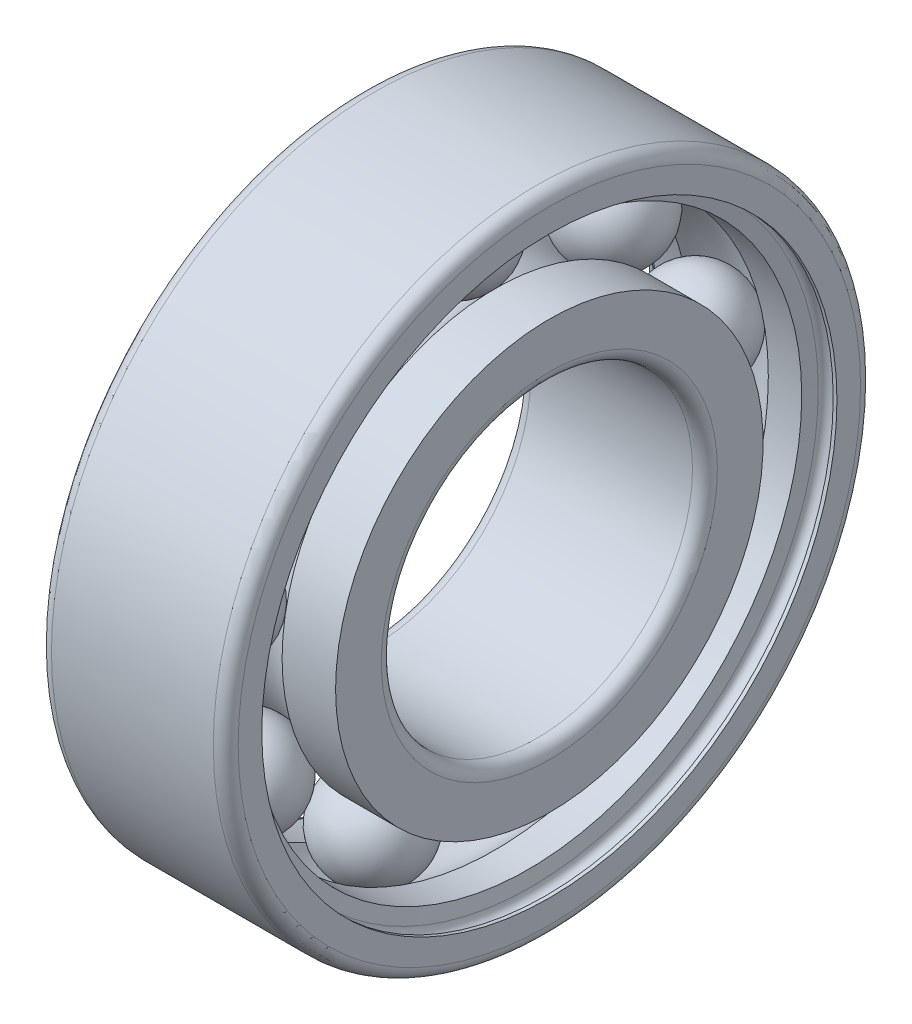
ISO-10303-21;
HEADER;
FILE_DESCRIPTION(('STEP AP214'),'2;1');
FILE_NAME('part.step','',(''),(''),'','','');
FILE_SCHEMA(('AUTOMOTIVE_DESIGN { 1 0 10303 214 1 1 1 1 }'));
ENDSEC;
DATA;
#1=APPLICATION_CONTEXT('core data for automotive mechanical design processes');
#2=APPLICATION_PROTOCOL_DEFINITION('international standard','automotive_design',2000,#1);
#3=PRODUCT_CONTEXT('',#1,'mechanical');
#4=PRODUCT('Part','Part','',(#3));
#5=PRODUCT_RELATED_PRODUCT_CATEGORY('part','',(#4));
#6=PRODUCT_DEFINITION_FORMATION('','',#4);
#7=PRODUCT_DEFINITION_CONTEXT('part definition',#1,'design');
#8=PRODUCT_DEFINITION('design','',#6,#7);
#9=PRODUCT_DEFINITION_SHAPE('','',#8);
#10=(LENGTH_UNIT() NAMED_UNIT(*) SI_UNIT(.MILLI.,.METRE.));
#11=(NAMED_UNIT(*) PLANE_ANGLE_UNIT() SI_UNIT($,.RADIAN.));
#12=(NAMED_UNIT(*) SI_UNIT($,.STERADIAN.) SOLID_ANGLE_UNIT());
#13=UNCERTAINTY_MEASURE_WITH_UNIT(LENGTH_MEASURE(1.E-05),#10,'distance_accuracy_value','');
#14=(GEOMETRIC_REPRESENTATION_CONTEXT(3) GLOBAL_UNCERTAINTY_ASSIGNED_CONTEXT((#13)) GLOBAL_UNIT_ASSIGNED_CONTEXT((#10,
#11,#12)) REPRESENTATION_CONTEXT('',''));
#15=CARTESIAN_POINT('',(0.,0.,0.));
#16=DIRECTION('',(0.,0.,1.));
#17=DIRECTION('',(1.,0.,0.));
#18=AXIS2_PLACEMENT_3D('',#15,#16,#17);
#19=CARTESIAN_POINT('',(7.5,-18.3427999577409,6.67623319771706));
#20=DIRECTION('',(0.594835222019223,0.114027365122037,0.795719057613092));
#21=DIRECTION('',(0.389955010349224,-0.906543165461709,-0.161600058967199));
#22=AXIS2_PLACEMENT_3D('',#19,#20,#21);
#23=SPHERICAL_SURFACE('',#22,3.969);
#24=CARTESIAN_POINT('',(5.13909900380571,-18.7953745699103,3.51802425805069));
#25=VERTEX_POINT('',#24);
#26=VERTEX_LOOP('',#25);
#27=FACE_BOUND('',#26,.T.);
#28=CARTESIAN_POINT('',(9.8609009961943,-17.8902253455716,9.83444213738342));
#29=VERTEX_POINT('',#28);
#30=VERTEX_LOOP('',#29);
#31=FACE_BOUND('',#30,.T.);
#32=ADVANCED_FACE('P0_F16',(#27,#31),#23,.T.);
#33=CLOSED_SHELL('',(#32));
#34=MANIFOLD_SOLID_BREP('P0_B1',#33);
#35=CARTESIAN_POINT('',(7.5,14.9531875296825,-12.5472141410813));
#36=DIRECTION('',(0.685398310930959,0.0351972029685046,0.727317201966365));
#37=DIRECTION('',(0.179287355466741,-0.976238967489698,-0.121710815149643));
#38=AXIS2_PLACEMENT_3D('',#35,#36,#37);
#39=SPHERICAL_SURFACE('',#38,3.969);
#40=CARTESIAN_POINT('',(10.220345896085,15.0928852282645,-9.66049216647675));
#41=VERTEX_POINT('',#40);
#42=VERTEX_LOOP('',#41);
#43=FACE_BOUND('',#42,.T.);
#44=CARTESIAN_POINT('',(4.77965410391502,14.8134898311005,-15.4339361156858));
#45=VERTEX_POINT('',#44);
#46=VERTEX_LOOP('',#45);
#47=FACE_BOUND('',#46,.T.);
#48=ADVANCED_FACE('P1_F16',(#43,#47),#39,.T.);
#49=CLOSED_SHELL('',(#48));
#50=MANIFOLD_SOLID_BREP('P1_B1',#49);
#51=CARTESIAN_POINT('',(7.5,-18.3427999577409,-6.67623319771706));
#52=DIRECTION('',(0.563600590312569,0.63589128279516,0.527253877239845));
#53=DIRECTION('',(-0.499752807633324,-0.245740386476579,0.830577385748584));
#54=AXIS2_PLACEMENT_3D('',#51,#52,#53);
#55=SPHERICAL_SURFACE('',#54,3.969);
#56=CARTESIAN_POINT('',(9.73693074295059,-15.818947456327,-4.58356255895211));
#57=VERTEX_POINT('',#56);
#58=VERTEX_LOOP('',#57);
#59=FACE_BOUND('',#58,.T.);
#60=CARTESIAN_POINT('',(5.26306925704942,-20.8666524591549,-8.76890383648201));
#61=VERTEX_POINT('',#60);
#62=VERTEX_LOOP('',#61);
#63=FACE_BOUND('',#62,.T.);
#64=ADVANCED_FACE('P2_F16',(#59,#63),#55,.T.);
#65=CLOSED_SHELL('',(#64));
#66=MANIFOLD_SOLID_BREP('P2_B1',#65);
#67=CARTESIAN_POINT('',(7.5,-9.76,-16.9048158818723));
#68=DIRECTION('',(0.779344493093709,0.468469271989966,0.416123421938373));
#69=DIRECTION('',(0.219537765298293,-0.82615440248939,0.518914321304809));
#70=AXIS2_PLACEMENT_3D('',#67,#68,#69);
#71=SPHERICAL_SURFACE('',#70,3.969);
#72=CARTESIAN_POINT('',(10.5932182930889,-7.90064545947182,-15.2532220201988));
#73=VERTEX_POINT('',#72);
#74=VERTEX_LOOP('',#73);
#75=FACE_BOUND('',#74,.T.);
#76=CARTESIAN_POINT('',(4.40678170691107,-11.6193545405282,-18.5564097435457));
#77=VERTEX_POINT('',#76);
#78=VERTEX_LOOP('',#77);
#79=FACE_BOUND('',#78,.T.);
#80=ADVANCED_FACE('P3_F16',(#75,#79),#71,.T.);
#81=CLOSED_SHELL('',(#80));
#82=MANIFOLD_SOLID_BREP('P3_B1',#81);
#83=CARTESIAN_POINT('',(7.5,14.9531875296825,12.5472141410813));
#84=DIRECTION('',(0.602247079146445,0.780314936971306,0.168543925429076));
#85=DIRECTION('',(-0.0322902880202742,-0.187142414914404,0.981801942267163));
#86=AXIS2_PLACEMENT_3D('',#83,#84,#85);
#87=SPHERICAL_SURFACE('',#86,3.969);
#88=CARTESIAN_POINT('',(5.10968134286776,11.8561175448433,11.8782633010533));
#89=VERTEX_POINT('',#88);
#90=VERTEX_LOOP('',#89);
#91=FACE_BOUND('',#90,.T.);
#92=CARTESIAN_POINT('',(9.89031865713224,18.0502575145216,13.2161649811093));
#93=VERTEX_POINT('',#92);
#94=VERTEX_LOOP('',#93);
#95=FACE_BOUND('',#94,.T.);
#96=ADVANCED_FACE('P4_F16',(#91,#95),#87,.T.);
#97=CLOSED_SHELL('',(#96));
#98=MANIFOLD_SOLID_BREP('P4_B1',#97);
#99=CARTESIAN_POINT('',(7.5,-9.76000000000001,16.9048158818722));
#100=DIRECTION('',(0.79230697990946,0.569937971101344,0.217762160816872));
#101=DIRECTION('',(-0.23847023537247,-0.0392416911110703,0.970356654287557));
#102=AXIS2_PLACEMENT_3D('',#99,#100,#101);
#103=SPHERICAL_SURFACE('',#102,3.969);
#104=CARTESIAN_POINT('',(4.35533359673935,-12.0220838073012,16.0405178655901));
#105=VERTEX_POINT('',#104);
#106=VERTEX_LOOP('',#105);
#107=FACE_BOUND('',#106,.T.);
#108=CARTESIAN_POINT('',(10.6446664032606,-7.49791619269878,17.7691138981544));
#109=VERTEX_POINT('',#108);
#110=VERTEX_LOOP('',#109);
#111=FACE_BOUND('',#110,.T.);
#112=ADVANCED_FACE('P5_F16',(#107,#111),#103,.T.);
#113=CLOSED_SHELL('',(#112));
#114=MANIFOLD_SOLID_BREP('P5_B1',#113);
#115=CARTESIAN_POINT('',(7.5,19.52,0.));
#116=DIRECTION('',(0.566207825724342,0.00267305168693628,0.824258183388671));
#117=DIRECTION('',(0.281698410188234,-0.940410538469459,-0.190457409498827));
#118=AXIS2_PLACEMENT_3D('',#115,#116,#117);
#119=SPHERICAL_SURFACE('',#118,3.969);
#120=CARTESIAN_POINT('',(5.25272113970009,19.5093906578546,-3.27148072986964));
#121=VERTEX_POINT('',#120);
#122=VERTEX_LOOP('',#121);
#123=FACE_BOUND('',#122,.T.);
#124=CARTESIAN_POINT('',(9.74727886029991,19.5306093421455,3.27148072986964));
#125=VERTEX_POINT('',#124);
#126=VERTEX_LOOP('',#125);
#127=FACE_BOUND('',#126,.T.);
#128=ADVANCED_FACE('P6_F16',(#123,#127),#119,.T.);
#129=CLOSED_SHELL('',(#128));
#130=MANIFOLD_SOLID_BREP('P6_B1',#129);
#131=CARTESIAN_POINT('',(50.,0.,0.));
#132=DIRECTION('',(-1.,0.,0.));
#133=DIRECTION('',(0.,0.,1.));
#134=AXIS2_PLACEMENT_3D('',#131,#132,#133);
#135=CYLINDRICAL_SURFACE('',#134,12.5);
#136=CARTESIAN_POINT('',(1.,0.,0.));
#137=DIRECTION('',(1.,0.,0.));
#138=DIRECTION('',(0.,0.,-1.));
#139=AXIS2_PLACEMENT_3D('',#136,#137,#138);
#140=CIRCLE('',#139,12.5);
#141=CARTESIAN_POINT('',(1.,0.,-12.5));
#142=VERTEX_POINT('',#141);
#143=EDGE_CURVE('P7_E65',#142,#142,#140,.T.);
#144=ORIENTED_EDGE('',*,*,#143,.F.);
#145=EDGE_LOOP('',(#144));
#146=FACE_BOUND('',#145,.T.);
#147=CARTESIAN_POINT('',(14.,0.,0.));
#148=DIRECTION('',(1.,0.,0.));
#149=DIRECTION('',(0.,0.,-1.));
#150=AXIS2_PLACEMENT_3D('',#147,#148,#149);
#151=CIRCLE('',#150,12.5);
#152=CARTESIAN_POINT('',(14.,0.,-12.5));
#153=VERTEX_POINT('',#152);
#154=EDGE_CURVE('P7_E68',#153,#153,#151,.F.);
#155=ORIENTED_EDGE('',*,*,#154,.F.);
#156=EDGE_LOOP('',(#155));
#157=FACE_BOUND('',#156,.T.);
#158=ADVANCED_FACE('P7_F14',(#146,#157),#135,.F.);
#159=CARTESIAN_POINT('',(14.,0.,0.));
#160=DIRECTION('',(1.,0.,0.));
#161=DIRECTION('',(0.,0.,-1.));
#162=AXIS2_PLACEMENT_3D('',#159,#160,#161);
#163=TOROIDAL_SURFACE('',#162,13.5,0.999999999999996);
#164=ORIENTED_EDGE('',*,*,#154,.T.);
#165=EDGE_LOOP('',(#164));
#166=FACE_BOUND('',#165,.T.);
#167=CARTESIAN_POINT('',(15.,0.,0.));
#168=DIRECTION('',(1.,0.,0.));
#169=DIRECTION('',(0.,0.,-1.));
#170=AXIS2_PLACEMENT_3D('',#167,#168,#169);
#171=CIRCLE('',#170,13.5);
#172=CARTESIAN_POINT('',(15.,0.,-13.5));
#173=VERTEX_POINT('',#172);
#174=EDGE_CURVE('P7_E38',#173,#173,#171,.F.);
#175=ORIENTED_EDGE('',*,*,#174,.F.);
#176=EDGE_LOOP('',(#175));
#177=FACE_BOUND('',#176,.T.);
#178=ADVANCED_FACE('P7_F58',(#166,#177),#163,.T.);
#179=CARTESIAN_POINT('',(1.,0.,0.));
#180=DIRECTION('',(1.,0.,0.));
#181=DIRECTION('',(0.,0.,-1.));
#182=AXIS2_PLACEMENT_3D('',#179,#180,#181);
#183=TOROIDAL_SURFACE('',#182,13.5,1.);
#184=CARTESIAN_POINT('',(0.,0.,0.));
#185=DIRECTION('',(-1.,0.,0.));
#186=DIRECTION('',(0.,0.,-1.));
#187=AXIS2_PLACEMENT_3D('',#184,#185,#186);
#188=CIRCLE('',#187,13.5);
#189=CARTESIAN_POINT('',(0.,0.,-13.5));
#190=VERTEX_POINT('',#189);
#191=EDGE_CURVE('P7_E71',#190,#190,#188,.F.);
#192=ORIENTED_EDGE('',*,*,#191,.F.);
#193=EDGE_LOOP('',(#192));
#194=FACE_BOUND('',#193,.T.);
#195=ORIENTED_EDGE('',*,*,#143,.T.);
#196=EDGE_LOOP('',(#195));
#197=FACE_BOUND('',#196,.T.);
#198=ADVANCED_FACE('P7_F53',(#194,#197),#183,.T.);
#199=CARTESIAN_POINT('',(15.,13.5,0.));
#200=DIRECTION('',(1.,0.,0.));
#201=DIRECTION('',(0.,0.,-1.));
#202=AXIS2_PLACEMENT_3D('',#199,#200,#201);
#203=PLANE('',#202);
#204=ORIENTED_EDGE('',*,*,#174,.T.);
#205=EDGE_LOOP('',(#204));
#206=FACE_BOUND('',#205,.T.);
#207=CARTESIAN_POINT('',(15.,0.,0.));
#208=DIRECTION('',(-1.,0.,0.));
#209=DIRECTION('',(0.,0.,1.));
#210=AXIS2_PLACEMENT_3D('',#207,#208,#209);
#211=CIRCLE('',#210,17.175);
#212=CARTESIAN_POINT('',(15.,0.,17.175));
#213=VERTEX_POINT('',#212);
#214=EDGE_CURVE('P7_E17',#213,#213,#211,.T.);
#215=ORIENTED_EDGE('',*,*,#214,.F.);
#216=EDGE_LOOP('',(#215));
#217=FACE_BOUND('',#216,.T.);
#218=ADVANCED_FACE('P7_F43',(#206,#217),#203,.T.);
#219=CARTESIAN_POINT('',(0.,17.175,0.));
#220=DIRECTION('',(-1.,0.,0.));
#221=DIRECTION('',(0.,0.,1.));
#222=AXIS2_PLACEMENT_3D('',#219,#220,#221);
#223=PLANE('',#222);
#224=CARTESIAN_POINT('',(0.,0.,0.));
#225=DIRECTION('',(-1.,0.,0.));
#226=DIRECTION('',(0.,0.,1.));
#227=AXIS2_PLACEMENT_3D('',#224,#225,#226);
#228=CIRCLE('',#227,17.175);
#229=CARTESIAN_POINT('',(0.,0.,17.175));
#230=VERTEX_POINT('',#229);
#231=EDGE_CURVE('P7_E26',#230,#230,#228,.F.);
#232=ORIENTED_EDGE('',*,*,#231,.F.);
#233=EDGE_LOOP('',(#232));
#234=FACE_BOUND('',#233,.T.);
#235=ORIENTED_EDGE('',*,*,#191,.T.);
#236=EDGE_LOOP('',(#235));
#237=FACE_BOUND('',#236,.T.);
#238=ADVANCED_FACE('P7_F52',(#234,#237),#223,.T.);
#239=CARTESIAN_POINT('',(50.,0.,0.));
#240=DIRECTION('',(-1.,0.,0.));
#241=DIRECTION('',(0.,0.,1.));
#242=AXIS2_PLACEMENT_3D('',#239,#240,#241);
#243=CYLINDRICAL_SURFACE('',#242,17.175);
#244=CARTESIAN_POINT('',(10.7021767596434,0.,0.));
#245=DIRECTION('',(1.,0.,0.));
#246=DIRECTION('',(0.,0.,-1.));
#247=AXIS2_PLACEMENT_3D('',#244,#245,#246);
#248=CIRCLE('',#247,17.175);
#249=CARTESIAN_POINT('',(10.7021767596434,0.,-17.175));
#250=VERTEX_POINT('',#249);
#251=EDGE_CURVE('P7_E21',#250,#250,#248,.T.);
#252=ORIENTED_EDGE('',*,*,#251,.T.);
#253=EDGE_LOOP('',(#252));
#254=FACE_BOUND('',#253,.T.);
#255=ORIENTED_EDGE('',*,*,#214,.T.);
#256=EDGE_LOOP('',(#255));
#257=FACE_BOUND('',#256,.T.);
#258=ADVANCED_FACE('P7_F108',(#254,#257),#243,.T.);
#259=CARTESIAN_POINT('',(50.,0.,0.));
#260=DIRECTION('',(-1.,0.,0.));
#261=DIRECTION('',(0.,0.,1.));
#262=AXIS2_PLACEMENT_3D('',#259,#260,#261);
#263=CYLINDRICAL_SURFACE('',#262,17.175);
#264=ORIENTED_EDGE('',*,*,#231,.T.);
#265=EDGE_LOOP('',(#264));
#266=FACE_BOUND('',#265,.T.);
#267=CARTESIAN_POINT('',(4.29782324035664,0.,0.));
#268=DIRECTION('',(1.,0.,0.));
#269=DIRECTION('',(0.,0.,-1.));
#270=AXIS2_PLACEMENT_3D('',#267,#268,#269);
#271=CIRCLE('',#270,17.175);
#272=CARTESIAN_POINT('',(4.29782324035664,0.,-17.175));
#273=VERTEX_POINT('',#272);
#274=EDGE_CURVE('P7_E9',#273,#273,#271,.F.);
#275=ORIENTED_EDGE('',*,*,#274,.T.);
#276=EDGE_LOOP('',(#275));
#277=FACE_BOUND('',#276,.T.);
#278=ADVANCED_FACE('P7_F105',(#266,#277),#263,.T.);
#279=CARTESIAN_POINT('',(7.5,0.,0.));
#280=DIRECTION('',(1.,0.,0.));
#281=DIRECTION('',(0.,0.,-1.));
#282=AXIS2_PLACEMENT_3D('',#279,#280,#281);
#283=TOROIDAL_SURFACE('',#282,19.52,3.969);
#284=ORIENTED_EDGE('',*,*,#274,.F.);
#285=EDGE_LOOP('',(#284));
#286=FACE_BOUND('',#285,.T.);
#287=ORIENTED_EDGE('',*,*,#251,.F.);
#288=EDGE_LOOP('',(#287));
#289=FACE_BOUND('',#288,.T.);
#290=ADVANCED_FACE('P7_F102',(#286,#289),#283,.F.);
#291=CLOSED_SHELL('',(#158,#178,#198,#218,#238,#258,#278,#290));
#292=MANIFOLD_SOLID_BREP('P7_B1',#291);
#293=CARTESIAN_POINT('',(7.5,0.,0.));
#294=DIRECTION('',(1.,0.,0.));
#295=DIRECTION('',(0.,0.,-1.));
#296=AXIS2_PLACEMENT_3D('',#293,#294,#295);
#297=TOROIDAL_SURFACE('',#296,19.52,3.969);
#298=CARTESIAN_POINT('',(10.6186432947678,0.,0.));
#299=DIRECTION('',(-1.,0.,0.));
#300=DIRECTION('',(0.,0.,1.));
#301=AXIS2_PLACEMENT_3D('',#298,#299,#300);
#302=CIRCLE('',#301,21.975);
#303=CARTESIAN_POINT('',(10.6186432947678,0.,21.975));
#304=VERTEX_POINT('',#303);
#305=EDGE_CURVE('P8_E119',#304,#304,#302,.F.);
#306=ORIENTED_EDGE('',*,*,#305,.T.);
#307=EDGE_LOOP('',(#306));
#308=FACE_BOUND('',#307,.T.);
#309=CARTESIAN_POINT('',(4.38135670523223,0.,0.));
#310=DIRECTION('',(-1.,0.,0.));
#311=DIRECTION('',(0.,0.,1.));
#312=AXIS2_PLACEMENT_3D('',#309,#310,#311);
#313=CIRCLE('',#312,21.975);
#314=CARTESIAN_POINT('',(4.38135670523223,0.,21.975));
#315=VERTEX_POINT('',#314);
#316=EDGE_CURVE('P8_E116',#315,#315,#313,.T.);
#317=ORIENTED_EDGE('',*,*,#316,.T.);
#318=EDGE_LOOP('',(#317));
#319=FACE_BOUND('',#318,.T.);
#320=ADVANCED_FACE('P8_F15',(#308,#319),#297,.F.);
#321=CARTESIAN_POINT('',(50.,0.,0.));
#322=DIRECTION('',(-1.,0.,0.));
#323=DIRECTION('',(0.,0.,1.));
#324=AXIS2_PLACEMENT_3D('',#321,#322,#323);
#325=CYLINDRICAL_SURFACE('',#324,21.975);
#326=CARTESIAN_POINT('',(13.3007505117994,0.,0.));
#327=DIRECTION('',(1.,0.,0.));
#328=DIRECTION('',(0.,0.,-1.));
#329=AXIS2_PLACEMENT_3D('',#326,#327,#328);
#330=CIRCLE('',#329,21.975);
#331=CARTESIAN_POINT('',(13.3007505117994,0.,-21.975));
#332=VERTEX_POINT('',#331);
#333=EDGE_CURVE('P8_E113',#332,#332,#330,.T.);
#334=ORIENTED_EDGE('',*,*,#333,.T.);
#335=EDGE_LOOP('',(#334));
#336=FACE_BOUND('',#335,.T.);
#337=ORIENTED_EDGE('',*,*,#305,.F.);
#338=EDGE_LOOP('',(#337));
#339=FACE_BOUND('',#338,.T.);
#340=ADVANCED_FACE('P8_F237',(#336,#339),#325,.F.);
#341=CARTESIAN_POINT('',(50.,0.,0.));
#342=DIRECTION('',(-1.,0.,0.));
#343=DIRECTION('',(0.,0.,1.));
#344=AXIS2_PLACEMENT_3D('',#341,#342,#343);
#345=CYLINDRICAL_SURFACE('',#344,21.975);
#346=ORIENTED_EDGE('',*,*,#316,.F.);
#347=EDGE_LOOP('',(#346));
#348=FACE_BOUND('',#347,.T.);
#349=CARTESIAN_POINT('',(1.69924948820056,0.,0.));
#350=DIRECTION('',(-1.,0.,0.));
#351=DIRECTION('',(0.,0.,1.));
#352=AXIS2_PLACEMENT_3D('',#349,#350,#351);
#353=CIRCLE('',#352,21.975);
#354=CARTESIAN_POINT('',(1.69924948820056,0.,21.975));
#355=VERTEX_POINT('',#354);
#356=EDGE_CURVE('P8_E110',#355,#355,#353,.T.);
#357=ORIENTED_EDGE('',*,*,#356,.T.);
#358=EDGE_LOOP('',(#357));
#359=FACE_BOUND('',#358,.T.);
#360=ADVANCED_FACE('P8_F227',(#348,#359),#345,.F.);
#361=CARTESIAN_POINT('',(13.5,0.,0.));
#362=DIRECTION('',(1.,0.,0.));
#363=DIRECTION('',(0.,1.,0.));
#364=AXIS2_PLACEMENT_3D('',#361,#362,#363);
#365=CONICAL_SURFACE('',#364,23.105,1.39626340159547);
#366=CARTESIAN_POINT('',(13.5,0.,0.));
#367=DIRECTION('',(1.,0.,0.));
#368=DIRECTION('',(0.,0.,-1.));
#369=AXIS2_PLACEMENT_3D('',#366,#367,#368);
#370=CIRCLE('',#369,23.105);
#371=CARTESIAN_POINT('',(13.5,0.,-23.105));
#372=VERTEX_POINT('',#371);
#373=EDGE_CURVE('P8_E104',#372,#372,#370,.T.);
#374=ORIENTED_EDGE('',*,*,#373,.T.);
#375=EDGE_LOOP('',(#374));
#376=FACE_BOUND('',#375,.T.);
#377=ORIENTED_EDGE('',*,*,#333,.F.);
#378=EDGE_LOOP('',(#377));
#379=FACE_BOUND('',#378,.T.);
#380=ADVANCED_FACE('P8_F218',(#376,#379),#365,.F.);
#381=CARTESIAN_POINT('',(1.5,0.,0.));
#382=DIRECTION('',(-1.,0.,0.));
#383=DIRECTION('',(0.,-1.,0.));
#384=AXIS2_PLACEMENT_3D('',#381,#382,#383);
#385=CONICAL_SURFACE('',#384,23.105,1.39626340159547);
#386=CARTESIAN_POINT('',(1.5,0.,0.));
#387=DIRECTION('',(1.,0.,0.));
#388=DIRECTION('',(0.,0.,-1.));
#389=AXIS2_PLACEMENT_3D('',#386,#387,#388);
#390=CIRCLE('',#389,23.105);
#391=CARTESIAN_POINT('',(1.5,0.,-23.105));
#392=VERTEX_POINT('',#391);
#393=EDGE_CURVE('P8_E100',#392,#392,#390,.F.);
#394=ORIENTED_EDGE('',*,*,#393,.T.);
#395=EDGE_LOOP('',(#394));
#396=FACE_BOUND('',#395,.T.);
#397=ORIENTED_EDGE('',*,*,#356,.F.);
#398=EDGE_LOOP('',(#397));
#399=FACE_BOUND('',#398,.T.);
#400=ADVANCED_FACE('P8_F209',(#396,#399),#385,.F.);
#401=CARTESIAN_POINT('',(14.1,0.,0.));
#402=DIRECTION('',(1.,0.,0.));
#403=DIRECTION('',(0.,0.,-1.));
#404=AXIS2_PLACEMENT_3D('',#401,#402,#403);
#405=TOROIDAL_SURFACE('',#404,23.10499998334,0.6);
#406=CARTESIAN_POINT('',(14.7,0.,0.));
#407=DIRECTION('',(-1.,0.,0.));
#408=DIRECTION('',(0.,0.,1.));
#409=AXIS2_PLACEMENT_3D('',#406,#407,#408);
#410=CIRCLE('',#409,23.1049999994129);
#411=CARTESIAN_POINT('',(14.7,0.,23.1049999994129));
#412=VERTEX_POINT('',#411);
#413=EDGE_CURVE('P8_E103',#412,#412,#410,.F.);
#414=ORIENTED_EDGE('',*,*,#413,.T.);
#415=EDGE_LOOP('',(#414));
#416=FACE_BOUND('',#415,.T.);
#417=ORIENTED_EDGE('',*,*,#373,.F.);
#418=EDGE_LOOP('',(#417));
#419=FACE_BOUND('',#418,.T.);
#420=ADVANCED_FACE('P8_F92',(#416,#419),#405,.F.);
#421=CARTESIAN_POINT('',(0.9,0.,0.));
#422=DIRECTION('',(1.,0.,0.));
#423=DIRECTION('',(0.,0.,-1.));
#424=AXIS2_PLACEMENT_3D('',#421,#422,#423);
#425=TOROIDAL_SURFACE('',#424,23.105,0.6);
#426=ORIENTED_EDGE('',*,*,#393,.F.);
#427=EDGE_LOOP('',(#426));
#428=FACE_BOUND('',#427,.T.);
#429=CARTESIAN_POINT('',(0.300000000000002,0.,0.));
#430=DIRECTION('',(-1.,0.,0.));
#431=DIRECTION('',(0.,0.,1.));
#432=AXIS2_PLACEMENT_3D('',#429,#430,#431);
#433=CIRCLE('',#432,23.105);
#434=CARTESIAN_POINT('',(0.300000000000002,0.,23.105));
#435=VERTEX_POINT('',#434);
#436=EDGE_CURVE('P8_E99',#435,#435,#433,.T.);
#437=ORIENTED_EDGE('',*,*,#436,.T.);
#438=EDGE_LOOP('',(#437));
#439=FACE_BOUND('',#438,.T.);
#440=ADVANCED_FACE('P8_F87',(#428,#439),#425,.F.);
#441=CARTESIAN_POINT('',(50.,0.,0.));
#442=DIRECTION('',(-1.,0.,0.));
#443=DIRECTION('',(0.,0.,1.));
#444=AXIS2_PLACEMENT_3D('',#441,#442,#443);
#445=CYLINDRICAL_SURFACE('',#444,23.1049999994129);
#446=ORIENTED_EDGE('',*,*,#413,.F.);
#447=EDGE_LOOP('',(#446));
#448=FACE_BOUND('',#447,.T.);
#449=CARTESIAN_POINT('',(15.,0.,0.));
#450=DIRECTION('',(-1.,0.,0.));
#451=DIRECTION('',(0.,0.,1.));
#452=AXIS2_PLACEMENT_3D('',#449,#450,#451);
#453=CIRCLE('',#452,23.1049999994129);
#454=CARTESIAN_POINT('',(15.,0.,23.1049999994129));
#455=VERTEX_POINT('',#454);
#456=EDGE_CURVE('P8_E19',#455,#455,#453,.T.);
#457=ORIENTED_EDGE('',*,*,#456,.F.);
#458=EDGE_LOOP('',(#457));
#459=FACE_BOUND('',#458,.T.);
#460=ADVANCED_FACE('P8_F83',(#448,#459),#445,.F.);
#461=CARTESIAN_POINT('',(50.,0.,0.));
#462=DIRECTION('',(-1.,0.,0.));
#463=DIRECTION('',(0.,0.,1.));
#464=AXIS2_PLACEMENT_3D('',#461,#462,#463);
#465=CYLINDRICAL_SURFACE('',#464,23.105);
#466=CARTESIAN_POINT('',(0.,0.,0.));
#467=DIRECTION('',(-1.,0.,0.));
#468=DIRECTION('',(0.,0.,1.));
#469=AXIS2_PLACEMENT_3D('',#466,#467,#468);
#470=CIRCLE('',#469,23.105);
#471=CARTESIAN_POINT('',(0.,0.,23.105));
#472=VERTEX_POINT('',#471);
#473=EDGE_CURVE('P8_E122',#472,#472,#470,.F.);
#474=ORIENTED_EDGE('',*,*,#473,.F.);
#475=EDGE_LOOP('',(#474));
#476=FACE_BOUND('',#475,.T.);
#477=ORIENTED_EDGE('',*,*,#436,.F.);
#478=EDGE_LOOP('',(#477));
#479=FACE_BOUND('',#478,.T.);
#480=ADVANCED_FACE('P8_F78',(#476,#479),#465,.F.);
#481=CARTESIAN_POINT('',(15.,23.105,0.));
#482=DIRECTION('',(1.,0.,0.));
#483=DIRECTION('',(0.,0.,-1.));
#484=AXIS2_PLACEMENT_3D('',#481,#482,#483);
#485=PLANE('',#484);
#486=ORIENTED_EDGE('',*,*,#456,.T.);
#487=EDGE_LOOP('',(#486));
#488=FACE_BOUND('',#487,.T.);
#489=CARTESIAN_POINT('',(15.,0.,0.));
#490=DIRECTION('',(-1.,0.,0.));
#491=DIRECTION('',(0.,0.,-1.));
#492=AXIS2_PLACEMENT_3D('',#489,#490,#491);
#493=CIRCLE('',#492,25.);
#494=CARTESIAN_POINT('',(15.,0.,-25.));
#495=VERTEX_POINT('',#494);
#496=EDGE_CURVE('P8_E62',#495,#495,#493,.T.);
#497=ORIENTED_EDGE('',*,*,#496,.F.);
#498=EDGE_LOOP('',(#497));
#499=FACE_BOUND('',#498,.T.);
#500=ADVANCED_FACE('P8_F68',(#488,#499),#485,.T.);
#501=CARTESIAN_POINT('',(0.,25.,0.));
#502=DIRECTION('',(-1.,0.,0.));
#503=DIRECTION('',(0.,0.,1.));
#504=AXIS2_PLACEMENT_3D('',#501,#502,#503);
#505=PLANE('',#504);
#506=CARTESIAN_POINT('',(0.,0.,0.));
#507=DIRECTION('',(1.,0.,0.));
#508=DIRECTION('',(0.,0.,-1.));
#509=AXIS2_PLACEMENT_3D('',#506,#507,#508);
#510=CIRCLE('',#509,25.);
#511=CARTESIAN_POINT('',(0.,0.,-25.));
#512=VERTEX_POINT('',#511);
#513=EDGE_CURVE('P8_E28',#512,#512,#510,.T.);
#514=ORIENTED_EDGE('',*,*,#513,.F.);
#515=EDGE_LOOP('',(#514));
#516=FACE_BOUND('',#515,.T.);
#517=ORIENTED_EDGE('',*,*,#473,.T.);
#518=EDGE_LOOP('',(#517));
#519=FACE_BOUND('',#518,.T.);
#520=ADVANCED_FACE('P8_F77',(#516,#519),#505,.T.);
#521=CARTESIAN_POINT('',(14.,0.,0.));
#522=DIRECTION('',(1.,0.,0.));
#523=DIRECTION('',(0.,0.,-1.));
#524=AXIS2_PLACEMENT_3D('',#521,#522,#523);
#525=TOROIDAL_SURFACE('',#524,25.,1.);
#526=ORIENTED_EDGE('',*,*,#496,.T.);
#527=EDGE_LOOP('',(#526));
#528=FACE_BOUND('',#527,.T.);
#529=CARTESIAN_POINT('',(14.,0.,0.));
#530=DIRECTION('',(-1.,0.,0.));
#531=DIRECTION('',(0.,0.,1.));
#532=AXIS2_PLACEMENT_3D('',#529,#530,#531);
#533=CIRCLE('',#532,26.);
#534=CARTESIAN_POINT('',(14.,0.,26.));
#535=VERTEX_POINT('',#534);
#536=EDGE_CURVE('P8_E23',#535,#535,#533,.T.);
#537=ORIENTED_EDGE('',*,*,#536,.F.);
#538=EDGE_LOOP('',(#537));
#539=FACE_BOUND('',#538,.T.);
#540=ADVANCED_FACE('P8_F42',(#528,#539),#525,.T.);
#541=CARTESIAN_POINT('',(1.00000000000001,0.,0.));
#542=DIRECTION('',(1.,0.,0.));
#543=DIRECTION('',(0.,0.,-1.));
#544=AXIS2_PLACEMENT_3D('',#541,#542,#543);
#545=TOROIDAL_SURFACE('',#544,25.,1.);
#546=CARTESIAN_POINT('',(1.,0.,0.));
#547=DIRECTION('',(-1.,0.,0.));
#548=DIRECTION('',(0.,0.,1.));
#549=AXIS2_PLACEMENT_3D('',#546,#547,#548);
#550=CIRCLE('',#549,26.);
#551=CARTESIAN_POINT('',(1.,0.,26.));
#552=VERTEX_POINT('',#551);
#553=EDGE_CURVE('P8_E10',#552,#552,#550,.F.);
#554=ORIENTED_EDGE('',*,*,#553,.F.);
#555=EDGE_LOOP('',(#554));
#556=FACE_BOUND('',#555,.T.);
#557=ORIENTED_EDGE('',*,*,#513,.T.);
#558=EDGE_LOOP('',(#557));
#559=FACE_BOUND('',#558,.T.);
#560=ADVANCED_FACE('P8_F36',(#556,#559),#545,.T.);
#561=CARTESIAN_POINT('',(50.,0.,0.));
#562=DIRECTION('',(-1.,0.,0.));
#563=DIRECTION('',(0.,0.,1.));
#564=AXIS2_PLACEMENT_3D('',#561,#562,#563);
#565=CYLINDRICAL_SURFACE('',#564,26.);
#566=ORIENTED_EDGE('',*,*,#536,.T.);
#567=EDGE_LOOP('',(#566));
#568=FACE_BOUND('',#567,.T.);
#569=ORIENTED_EDGE('',*,*,#553,.T.);
#570=EDGE_LOOP('',(#569));
#571=FACE_BOUND('',#570,.T.);
#572=ADVANCED_FACE('P8_F41',(#568,#571),#565,.T.);
#573=CLOSED_SHELL('',(#320,#340,#360,#380,#400,#420,#440,#460,#480,#500,#520,#540,#560,#572));
#574=MANIFOLD_SOLID_BREP('P8_B1',#573);
#575=CARTESIAN_POINT('',(7.5,3.38961242805847,19.2234473387983));
#576=DIRECTION('',(0.575880503553871,0.71854895701241,0.389934663761658));
#577=DIRECTION('',(-0.564021941836943,0.00392528215792162,0.825750471562969));
#578=AXIS2_PLACEMENT_3D('',#575,#576,#577);
#579=SPHERICAL_SURFACE('',#578,3.969);
#580=CARTESIAN_POINT('',(5.21433028139469,0.537691617676218,17.6757966583283));
#581=VERTEX_POINT('',#580);
#582=VERTEX_LOOP('',#581);
#583=FACE_BOUND('',#582,.T.);
#584=CARTESIAN_POINT('',(9.78566971860532,6.24153323844073,20.7710980192683));
#585=VERTEX_POINT('',#584);
#586=VERTEX_LOOP('',#585);
#587=FACE_BOUND('',#586,.T.);
#588=ADVANCED_FACE('P9_F16',(#583,#587),#579,.T.);
#589=CLOSED_SHELL('',(#588));
#590=MANIFOLD_SOLID_BREP('P9_B1',#589);
#591=CARTESIAN_POINT('',(7.5,3.38961242805848,-19.2234473387983));
#592=DIRECTION('',(0.602675217522004,0.636921793218839,0.480742354601406));
#593=DIRECTION('',(-0.321428288048051,-0.35765094369208,0.87679510612153));
#594=AXIS2_PLACEMENT_3D('',#591,#592,#593);
#595=SPHERICAL_SURFACE('',#594,3.969);
#596=CARTESIAN_POINT('',(9.89201793834484,5.91755502534405,-17.3153809333853));
#597=VERTEX_POINT('',#596);
#598=VERTEX_LOOP('',#597);
#599=FACE_BOUND('',#598,.T.);
#600=CARTESIAN_POINT('',(5.10798206165517,0.861669830772912,-21.1315137442113));
#601=VERTEX_POINT('',#600);
#602=VERTEX_LOOP('',#601);
#603=FACE_BOUND('',#602,.T.);
#604=ADVANCED_FACE('P10_F16',(#599,#603),#595,.T.);
#605=CLOSED_SHELL('',(#604));
#606=MANIFOLD_SOLID_BREP('P10_B1',#605);
#607=ADVANCED_BREP_SHAPE_REPRESENTATION('',(#18,#34,#50,#66,#82,#98,#114,#130,#292,#574,#590,
#606),#14);
#608=SHAPE_DEFINITION_REPRESENTATION(#9,#607);
ENDSEC;
END-ISO-10303-21;
